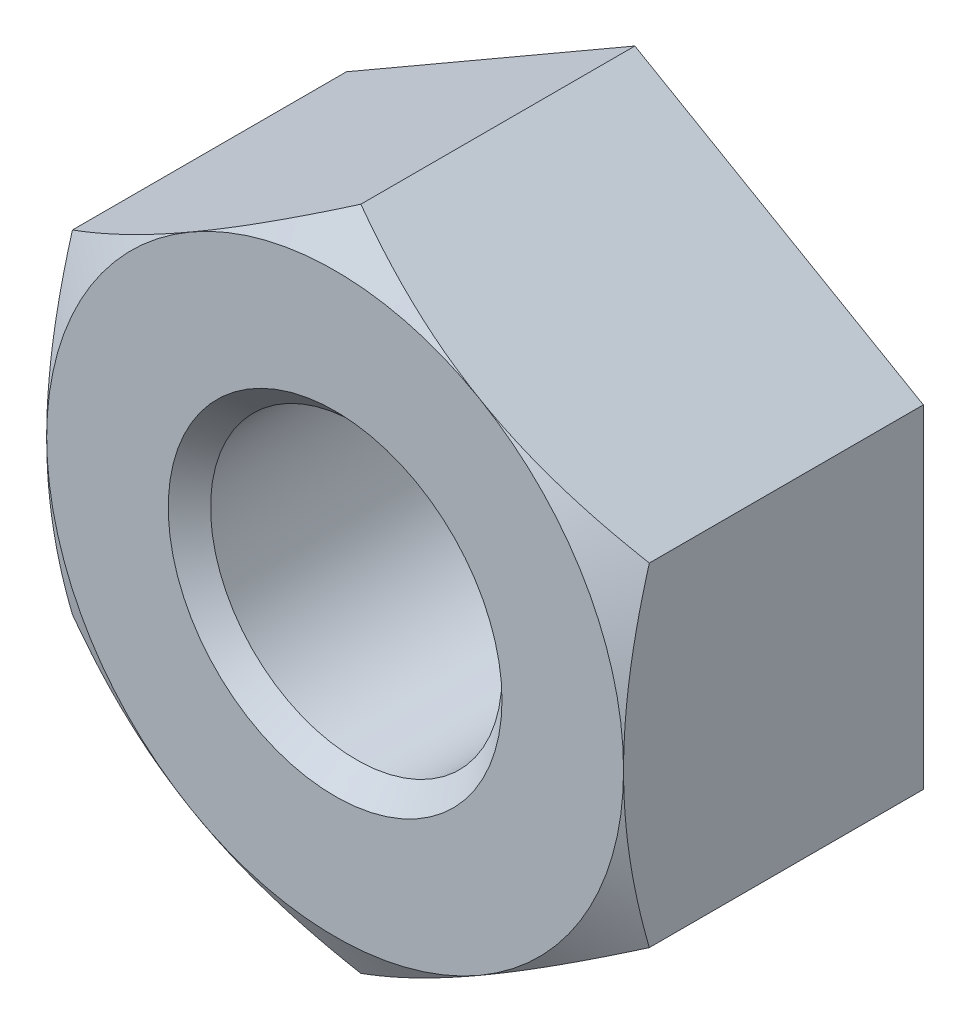
ISO-10303-21;
HEADER;
FILE_DESCRIPTION(('STEP AP214'),'2;1');
FILE_NAME('part.step','',(''),(''),'','','');
FILE_SCHEMA(('AUTOMOTIVE_DESIGN { 1 0 10303 214 1 1 1 1 }'));
ENDSEC;
DATA;
#1=APPLICATION_CONTEXT('core data for automotive mechanical design processes');
#2=APPLICATION_PROTOCOL_DEFINITION('international standard','automotive_design',2000,#1);
#3=PRODUCT_CONTEXT('',#1,'mechanical');
#4=PRODUCT('Part','Part','',(#3));
#5=PRODUCT_RELATED_PRODUCT_CATEGORY('part','',(#4));
#6=PRODUCT_DEFINITION_FORMATION('','',#4);
#7=PRODUCT_DEFINITION_CONTEXT('part definition',#1,'design');
#8=PRODUCT_DEFINITION('design','',#6,#7);
#9=PRODUCT_DEFINITION_SHAPE('','',#8);
#10=(LENGTH_UNIT() NAMED_UNIT(*) SI_UNIT(.MILLI.,.METRE.));
#11=(NAMED_UNIT(*) PLANE_ANGLE_UNIT() SI_UNIT($,.RADIAN.));
#12=(NAMED_UNIT(*) SI_UNIT($,.STERADIAN.) SOLID_ANGLE_UNIT());
#13=UNCERTAINTY_MEASURE_WITH_UNIT(LENGTH_MEASURE(1.E-05),#10,'distance_accuracy_value','');
#14=(GEOMETRIC_REPRESENTATION_CONTEXT(3) GLOBAL_UNCERTAINTY_ASSIGNED_CONTEXT((#13)) GLOBAL_UNIT_ASSIGNED_CONTEXT((#10,
#11,#12)) REPRESENTATION_CONTEXT('',''));
#15=CARTESIAN_POINT('',(0.,0.,0.));
#16=DIRECTION('',(0.,0.,1.));
#17=DIRECTION('',(1.,0.,0.));
#18=AXIS2_PLACEMENT_3D('',#15,#16,#17);
#19=CARTESIAN_POINT('',(0.,-24.,21.6));
#20=DIRECTION('',(-0.5,0.866025403784439,0.));
#21=DIRECTION('',(-0.866025403784439,-0.5,0.));
#22=AXIS2_PLACEMENT_3D('',#19,#20,#21);
#23=PLANE('',#22);
#24=CARTESIAN_POINT('',(-0.000199999999996838,-24.0001154700538,19.7435268723012));
#25=CARTESIAN_POINT('',(0.456636902036748,-23.7363605616872,19.8957950231701));
#26=CARTESIAN_POINT('',(0.915255712969352,-23.4715768677398,20.0411534574922));
#27=CARTESIAN_POINT('',(1.83617090998652,-22.9398862308411,20.3161302416855));
#28=CARTESIAN_POINT('',(2.29846845265265,-22.6729786201371,20.4457434146858));
#29=CARTESIAN_POINT('',(3.22763457782562,-22.1365243076466,20.6874874041532));
#30=CARTESIAN_POINT('',(3.69451129135353,-21.8669729114129,20.7995768558665));
#31=CARTESIAN_POINT('',(4.63150881836863,-21.3259971369607,21.0038664716216));
#32=CARTESIAN_POINT('',(5.10162944447372,-21.0545728669274,21.0960677747242));
#33=CARTESIAN_POINT('',(6.03306874892725,-20.5168061337673,21.2566595090508));
#34=CARTESIAN_POINT('',(6.4943182779903,-20.2505035939992,21.3255814723418));
#35=CARTESIAN_POINT('',(7.41893082723539,-19.7166782897964,21.4411479838631));
#36=CARTESIAN_POINT('',(7.88229388792627,-19.449155501974,21.4877921032801));
#37=CARTESIAN_POINT('',(8.8097983795347,-18.9136605340693,21.5576251858173));
#38=CARTESIAN_POINT('',(9.2739382259314,-18.6456892688105,21.5808420204719));
#39=CARTESIAN_POINT('',(10.2026462473922,-18.1094994426216,21.6033212604247));
#40=CARTESIAN_POINT('',(10.667214408777,-17.8412808895891,21.6025844059287));
#41=CARTESIAN_POINT('',(11.5357335216089,-17.3398411459993,21.578829236137));
#42=CARTESIAN_POINT('',(11.9397463270788,-17.1065842440052,21.5587076543318));
#43=CARTESIAN_POINT('',(12.7468074120657,-16.6406273093356,21.5007301929938));
#44=CARTESIAN_POINT('',(13.1498557053137,-16.4079272687324,21.4628745674587));
#45=CARTESIAN_POINT('',(13.9548388513136,-15.9431700326963,21.3700851020353));
#46=CARTESIAN_POINT('',(14.3567723642648,-15.7111136107975,21.3151358186335));
#47=CARTESIAN_POINT('',(15.158714854449,-15.2481118982151,21.1891315548785));
#48=CARTESIAN_POINT('',(15.5587238398289,-15.0171666028277,21.1180766427664));
#49=CARTESIAN_POINT('',(16.7730660131039,-14.3160658221991,20.8789299412628));
#50=CARTESIAN_POINT('',(17.5839490231285,-13.8479022980801,20.6869794527175));
#51=CARTESIAN_POINT('',(18.7913185058485,-13.1508272022204,20.3601926803062));
#52=CARTESIAN_POINT('',(19.1919365207695,-12.9195302834635,20.2449045107318));
#53=CARTESIAN_POINT('',(19.9904015202256,-12.458536301089,20.0026566529107));
#54=CARTESIAN_POINT('',(20.3882492519732,-12.2288388060681,19.8757002543211));
#55=CARTESIAN_POINT('',(20.7848096908265,-11.9998845299462,19.7435268723012));
#56=B_SPLINE_CURVE_WITH_KNOTS('',3,(#24,#25,#26,#27,#28,#29,#30,#31,#32,#33,#34,#35,#36,#37,#38,
#39,#40,#41,#42,#43,#44,#45,#46,#47,#48,#49,#50,#51,#52,#53,#54,#55),.UNSPECIFIED.,.F.,.F.,(4,2,
2,2,2,2,2,2,2,2,2,2,2,2,2,4),(0.,1.64718297300076,3.29490606443561,4.94646171874214,
6.597922757806,8.2086223270406,9.81935289844249,11.4281649098404,13.0369272065082,
14.4374315945823,15.8379159244004,17.2396692350121,18.6414166063712,21.5066563429885,
22.9367804503371,24.3665025883493),.UNSPECIFIED.);
#57=CARTESIAN_POINT('',(0.,-24.,19.743593539449));
#58=VERTEX_POINT('',#57);
#59=CARTESIAN_POINT('',(10.3923048454132,-18.,21.6));
#60=VERTEX_POINT('',#59);
#61=EDGE_CURVE('E231',#58,#60,#56,.T.);
#62=ORIENTED_EDGE('',*,*,#61,.F.);
#63=DIRECTION('',(0.,0.,-1.));
#64=VECTOR('',#63,1.);
#65=CARTESIAN_POINT('',(0.,-24.,21.6));
#66=LINE('',#65,#64);
#67=CARTESIAN_POINT('',(0.,-24.,0.));
#68=VERTEX_POINT('',#67);
#69=EDGE_CURVE('E234',#58,#68,#66,.T.);
#70=ORIENTED_EDGE('',*,*,#69,.T.);
#71=DIRECTION('',(0.866025403784439,0.5,0.));
#72=VECTOR('',#71,1.);
#73=CARTESIAN_POINT('',(0.,-24.,0.));
#74=LINE('',#73,#72);
#75=CARTESIAN_POINT('',(20.7846096908265,-12.,0.));
#76=VERTEX_POINT('',#75);
#77=EDGE_CURVE('E238',#68,#76,#74,.T.);
#78=ORIENTED_EDGE('',*,*,#77,.T.);
#79=DIRECTION('',(0.,0.,-1.));
#80=VECTOR('',#79,1.);
#81=CARTESIAN_POINT('',(20.7846096908265,-12.,21.6));
#82=LINE('',#81,#80);
#83=CARTESIAN_POINT('',(20.7846096908265,-12.,19.743593539449));
#84=VERTEX_POINT('',#83);
#85=EDGE_CURVE('E262',#84,#76,#82,.T.);
#86=ORIENTED_EDGE('',*,*,#85,.F.);
#87=EDGE_CURVE('E185',#60,#84,#56,.T.);
#88=ORIENTED_EDGE('',*,*,#87,.F.);
#89=EDGE_LOOP('',(#62,#70,#78,#86,#88));
#90=FACE_BOUND('',#89,.T.);
#91=ADVANCED_FACE('F48',(#90),#23,.F.);
#92=CARTESIAN_POINT('',(20.7846096908265,-12.,21.6));
#93=DIRECTION('',(-1.,0.,0.));
#94=DIRECTION('',(0.,0.,1.));
#95=AXIS2_PLACEMENT_3D('',#92,#93,#94);
#96=PLANE('',#95);
#97=CARTESIAN_POINT('',(20.7846096908265,-43.0997855814386,5.97397653681123));
#98=CARTESIAN_POINT('',(20.7846096908265,-42.5989361833653,6.2344351098979));
#99=CARTESIAN_POINT('',(20.7846096908265,-42.09773834524,6.4942234300361));
#100=CARTESIAN_POINT('',(20.7846096908265,-41.0945773206622,7.01232139507122));
#101=CARTESIAN_POINT('',(20.7846096908265,-40.5926141321068,7.27063103589572));
#102=CARTESIAN_POINT('',(20.7846096908265,-39.0854359948363,8.04315405656702));
#103=CARTESIAN_POINT('',(20.7846096908265,-38.0789743174458,8.55493974582766));
#104=CARTESIAN_POINT('',(20.7846096908265,-36.0605206322507,9.57142608881276));
#105=CARTESIAN_POINT('',(20.7846096908265,-35.0485224729889,10.0761145402675));
#106=CARTESIAN_POINT('',(20.7846096908265,-33.0197429936407,11.0757629369177));
#107=CARTESIAN_POINT('',(20.7846096908265,-32.0029617460945,11.5707230290674));
#108=CARTESIAN_POINT('',(20.7846096908265,-29.9067541575499,12.5757757891206));
#109=CARTESIAN_POINT('',(20.7846096908265,-28.8269944805033,13.0851745934609));
#110=CARTESIAN_POINT('',(20.7846096908265,-26.6594184021724,14.0867435367665));
#111=CARTESIAN_POINT('',(20.7846096908265,-25.5716016735173,14.5789129709707));
#112=CARTESIAN_POINT('',(20.7846096908265,-23.9327379399297,15.3001672173619));
#113=CARTESIAN_POINT('',(20.7846096908265,-23.3854029205562,15.5376926696126));
#114=CARTESIAN_POINT('',(20.7846096908265,-22.2879749234547,16.0062772481039));
#115=CARTESIAN_POINT('',(20.7846096908265,-21.7378819810851,16.2373364569975));
#116=CARTESIAN_POINT('',(20.7846096908265,-20.6346672316356,16.692010759113));
#117=CARTESIAN_POINT('',(20.7846096908265,-20.0815456356525,16.9156263636518));
#118=CARTESIAN_POINT('',(20.7846096908265,-18.9719187674171,17.3542806013467));
#119=CARTESIAN_POINT('',(20.7846096908265,-18.4154135625281,17.5693194046154));
#120=CARTESIAN_POINT('',(20.7846096908265,-17.2292067630723,18.0156200363005));
#121=CARTESIAN_POINT('',(20.7846096908265,-16.5990107252842,18.2455727378192));
#122=CARTESIAN_POINT('',(20.7846096908265,-15.3334038860175,18.6907025359907));
#123=CARTESIAN_POINT('',(20.7846096908265,-14.6979930955388,18.9058796638021));
#124=CARTESIAN_POINT('',(20.7846096908265,-13.4213831714848,19.3188474203842));
#125=CARTESIAN_POINT('',(20.7846096908265,-12.7801829382259,19.5166346659975));
#126=CARTESIAN_POINT('',(20.7846096908265,-11.4917797076664,19.8917108871347));
#127=CARTESIAN_POINT('',(20.7846096908265,-10.8445767180518,20.0689998889011));
#128=CARTESIAN_POINT('',(20.7846096908265,-9.55721007109625,20.3962988138016));
#129=CARTESIAN_POINT('',(20.7846096908265,-8.91716914819608,20.5467883204717));
#130=CARTESIAN_POINT('',(20.7846096908265,-7.63145591258406,20.8213386581674));
#131=CARTESIAN_POINT('',(20.7846096908265,-6.98578410003926,20.9454018121343));
#132=CARTESIAN_POINT('',(20.7846096908265,-5.68966360052536,21.1636504566021));
#133=CARTESIAN_POINT('',(20.7846096908265,-5.03921721415739,21.2578494794243));
#134=CARTESIAN_POINT('',(20.7846096908265,-3.7343790496286,21.4134191265944));
#135=CARTESIAN_POINT('',(20.7846096908265,-3.07998733027104,21.474790239009));
#136=CARTESIAN_POINT('',(20.7846096908265,-1.75816611114023,21.5632036210579));
#137=CARTESIAN_POINT('',(20.7846096908265,-1.09069765324586,21.5896713760324));
#138=CARTESIAN_POINT('',(20.7846096908265,0.244679452132822,21.6053586746947));
#139=CARTESIAN_POINT('',(20.7846096908265,0.912588098428259,21.594578318575));
#140=CARTESIAN_POINT('',(20.7846096908265,2.24690492064425,21.5361993153806));
#141=CARTESIAN_POINT('',(20.7846096908265,2.91331277985164,21.4885935158275));
#142=CARTESIAN_POINT('',(20.7846096908265,4.2426782314415,21.3583901936291));
#143=CARTESIAN_POINT('',(20.7846096908265,4.90563573087467,21.2757917332048));
#144=CARTESIAN_POINT('',(20.7846096908265,6.24071550885202,21.0763984685344));
#145=CARTESIAN_POINT('',(20.7846096908265,6.91273404643444,20.9589157039043));
#146=CARTESIAN_POINT('',(20.7846096908265,8.25083437505879,20.6941744551351));
#147=CARTESIAN_POINT('',(20.7846096908265,8.91691606787133,20.5469154792784));
#148=CARTESIAN_POINT('',(20.7846096908265,10.2429897317002,20.2264439842866));
#149=CARTESIAN_POINT('',(20.7846096908265,10.9029796227504,20.0532229251456));
#150=CARTESIAN_POINT('',(20.7846096908265,12.21668653217,19.6845668997067));
#151=CARTESIAN_POINT('',(20.7846096908265,12.8704035339689,19.489131874746));
#152=CARTESIAN_POINT('',(20.7846096908265,14.187002415088,19.0746262073177));
#153=CARTESIAN_POINT('',(20.7846096908265,14.8497437954169,18.8551115394823));
#154=CARTESIAN_POINT('',(20.7846096908265,16.1694965483315,18.3994198467114));
#155=CARTESIAN_POINT('',(20.7846096908265,16.8265075325798,18.1632417022331));
#156=CARTESIAN_POINT('',(20.7846096908265,18.1354729138445,17.6768046587224));
#157=CARTESIAN_POINT('',(20.7846096908265,18.7874259456337,17.4265420988875));
#158=CARTESIAN_POINT('',(20.7846096908265,20.0866415749163,16.9141967733352));
#159=CARTESIAN_POINT('',(20.7846096908265,20.7339042699333,16.6521142542072));
#160=CARTESIAN_POINT('',(20.7846096908265,22.0251484330647,16.1175861645394));
#161=CARTESIAN_POINT('',(20.7846096908265,22.6691243053237,15.8451271073362));
#162=CARTESIAN_POINT('',(20.7846096908265,23.9534004319582,15.2916884664446));
#163=CARTESIAN_POINT('',(20.7846096908265,24.5937006709419,15.0107088471071));
#164=CARTESIAN_POINT('',(20.7846096908265,25.8709641196289,14.4415212743335));
#165=CARTESIAN_POINT('',(20.7846096908265,26.5079278003821,14.153314376405));
#166=CARTESIAN_POINT('',(20.7846096908265,27.7789891265454,13.5706618900675));
#167=CARTESIAN_POINT('',(20.7846096908265,28.4130867781743,13.2762163152036));
#168=CARTESIAN_POINT('',(20.7846096908265,30.2328321620722,12.4218213030788));
#169=CARTESIAN_POINT('',(20.7846096908265,31.4153118160678,11.855122180744));
#170=CARTESIAN_POINT('',(20.7846096908265,33.773262860061,10.7072618870471));
#171=CARTESIAN_POINT('',(20.7846096908265,34.9487339603228,10.1261001228637));
#172=CARTESIAN_POINT('',(20.7846096908265,37.2894327133953,8.95476744233524));
#173=CARTESIAN_POINT('',(20.7846096908265,38.454682443985,8.36464059320867));
#174=CARTESIAN_POINT('',(20.7846096908265,40.199076625207,7.47279127501705));
#175=CARTESIAN_POINT('',(20.7846096908265,40.7799348778304,7.17441208481234));
#176=CARTESIAN_POINT('',(20.7846096908265,41.940612358727,6.57564580385574));
#177=CARTESIAN_POINT('',(20.7846096908265,42.5204315917301,6.2752587222739));
#178=CARTESIAN_POINT('',(20.7846096908265,43.0997855814386,5.97397653681123));
#179=B_SPLINE_CURVE_WITH_KNOTS('',3,(#97,#98,#99,#100,#101,#102,#103,#104,#105,#106,#107,#108,
#109,#110,#111,#112,#113,#114,#115,#116,#117,#118,#119,#120,#121,#122,#123,#124,#125,#126,#127,
#128,#129,#130,#131,#132,#133,#134,#135,#136,#137,#138,#139,#140,#141,#142,#143,#144,#145,#146,
#147,#148,#149,#150,#151,#152,#153,#154,#155,#156,#157,#158,#159,#160,#161,#162,#163,#164,#165,
#166,#167,#168,#169,#170,#171,#172,#173,#174,#175,#176,#177,#178),.UNSPECIFIED.,.F.,.F.,(4,2,2,
2,2,2,2,2,2,2,2,2,2,2,2,2,2,2,2,2,2,2,2,2,2,2,2,2,2,2,2,2,2,2,2,2,2,2,2,2,4),(0.,
1.69357486877677,3.38715439956217,6.7744549869629,10.1670023352168,13.5594983970648,
17.1410530675821,20.7227540695419,22.5126777468645,24.3025785345073,26.0923561152539,
27.8820981797877,29.8944586297115,31.906814835852,33.9195616785055,35.9323059443584,
37.9043039785198,39.876128597607,41.847058443329,43.8179589855703,45.8209119003034,
47.823859427361,49.82719607769,51.8305864194563,53.8764565307001,55.9223604297369,
57.9689387944581,60.0155225639183,62.1097094000332,64.2040370692012,66.2989116301004,
68.3937425076649,70.4913958074674,72.5890578848244,74.6864153731571,76.7837683083221,
80.7174069081152,84.6512070135627,88.5696385660031,90.5286757028045,92.4877038987843),.UNSPECIFIED.);
#180=CARTESIAN_POINT('',(20.7846096908265,0.,21.6));
#181=VERTEX_POINT('',#180);
#182=EDGE_CURVE('E314',#84,#181,#179,.T.);
#183=ORIENTED_EDGE('',*,*,#182,.F.);
#184=ORIENTED_EDGE('',*,*,#85,.T.);
#185=DIRECTION('',(0.,1.,0.));
#186=VECTOR('',#185,1.);
#187=CARTESIAN_POINT('',(20.7846096908265,-12.,0.));
#188=LINE('',#187,#186);
#189=CARTESIAN_POINT('',(20.7846096908265,12.,0.));
#190=VERTEX_POINT('',#189);
#191=EDGE_CURVE('E319',#76,#190,#188,.T.);
#192=ORIENTED_EDGE('',*,*,#191,.T.);
#193=DIRECTION('',(0.,0.,-1.));
#194=VECTOR('',#193,1.);
#195=CARTESIAN_POINT('',(20.7846096908265,12.,21.6));
#196=LINE('',#195,#194);
#197=CARTESIAN_POINT('',(20.7846096908265,12.,19.743593539449));
#198=VERTEX_POINT('',#197);
#199=EDGE_CURVE('E260',#198,#190,#196,.T.);
#200=ORIENTED_EDGE('',*,*,#199,.F.);
#201=EDGE_CURVE('E125',#181,#198,#179,.T.);
#202=ORIENTED_EDGE('',*,*,#201,.F.);
#203=EDGE_LOOP('',(#183,#184,#192,#200,#202));
#204=FACE_BOUND('',#203,.T.);
#205=ADVANCED_FACE('F222',(#204),#96,.F.);
#206=CARTESIAN_POINT('',(20.7846096908265,12.,21.6));
#207=DIRECTION('',(-0.5,-0.866025403784439,0.));
#208=DIRECTION('',(0.866025403784439,-0.5,0.));
#209=AXIS2_PLACEMENT_3D('',#206,#207,#208);
#210=PLANE('',#209);
#211=CARTESIAN_POINT('',(20.7848096908265,11.9998845299462,19.7435268723012));
#212=CARTESIAN_POINT('',(20.3279727887898,12.2636394383128,19.8957950231701));
#213=CARTESIAN_POINT('',(19.8693539778572,12.5284231322602,20.0411534574922));
#214=CARTESIAN_POINT('',(18.94843878084,13.0601137691589,20.3161302416855));
#215=CARTESIAN_POINT('',(18.4861412381739,13.3270213798629,20.4457434146858));
#216=CARTESIAN_POINT('',(17.5569751130009,13.8634756923534,20.6874874041532));
#217=CARTESIAN_POINT('',(17.090098399473,14.1330270885871,20.7995768558665));
#218=CARTESIAN_POINT('',(16.1531008724579,14.6740028630393,21.0038664716216));
#219=CARTESIAN_POINT('',(15.6829802463528,14.9454271330726,21.0960677747242));
#220=CARTESIAN_POINT('',(14.7515409418993,15.4831938662327,21.2566595090508));
#221=CARTESIAN_POINT('',(14.2902914128362,15.7494964060008,21.3255814723418));
#222=CARTESIAN_POINT('',(13.3656788635911,16.2833217102036,21.4411479838631));
#223=CARTESIAN_POINT('',(12.9023158029002,16.550844498026,21.4877921032801));
#224=CARTESIAN_POINT('',(11.9748113112918,17.0863394659307,21.5576251858173));
#225=CARTESIAN_POINT('',(11.5106714648951,17.3543107311895,21.5808420204719));
#226=CARTESIAN_POINT('',(10.5819634434344,17.8905005573784,21.6033212604247));
#227=CARTESIAN_POINT('',(10.1173952820495,18.1587191104109,21.6025844059287));
#228=CARTESIAN_POINT('',(9.24887616921765,18.6601588540007,21.578829236137));
#229=CARTESIAN_POINT('',(8.84486336374767,18.8934157559948,21.5587076543318));
#230=CARTESIAN_POINT('',(8.03780227876085,19.3593726906644,21.5007301929938));
#231=CARTESIAN_POINT('',(7.63475398551279,19.5920727312676,21.4628745674587));
#232=CARTESIAN_POINT('',(6.82977083951291,20.0568299673038,21.3700851020353));
#233=CARTESIAN_POINT('',(6.42783732656167,20.2888863892025,21.3151358186335));
#234=CARTESIAN_POINT('',(5.62589483637755,20.7518881017849,21.1891315548785));
#235=CARTESIAN_POINT('',(5.22588585099759,20.9828333971723,21.1180766427664));
#236=CARTESIAN_POINT('',(4.01154367772264,21.6839341778009,20.8789299412628));
#237=CARTESIAN_POINT('',(3.200660667698,22.1520977019199,20.6869794527175));
#238=CARTESIAN_POINT('',(1.99329118497798,22.8491727977797,20.3601926803062));
#239=CARTESIAN_POINT('',(1.59267317005705,23.0804697165365,20.2449045107318));
#240=CARTESIAN_POINT('',(0.794208170600872,23.541463698911,20.0026566529107));
#241=CARTESIAN_POINT('',(0.396360438853325,23.7711611939319,19.8757002543211));
#242=CARTESIAN_POINT('',(-0.00019999999998815,24.0001154700538,19.7435268723012));
#243=B_SPLINE_CURVE_WITH_KNOTS('',3,(#211,#212,#213,#214,#215,#216,#217,#218,#219,#220,#221,
#222,#223,#224,#225,#226,#227,#228,#229,#230,#231,#232,#233,#234,#235,#236,#237,#238,#239,#240,
#241,#242),.UNSPECIFIED.,.F.,.F.,(4,2,2,2,2,2,2,2,2,2,2,2,2,2,2,4),(0.,1.64718297300076,
3.29490606443561,4.94646171874215,6.59792275780601,8.20862232704061,9.81935289844249,
11.4281649098404,13.0369272065082,14.4374315945823,15.8379159244004,17.2396692350121,
18.6414166063712,21.5066563429885,22.9367804503371,24.3665025883493),.UNSPECIFIED.);
#244=CARTESIAN_POINT('',(10.3923048454133,18.,21.6));
#245=VERTEX_POINT('',#244);
#246=EDGE_CURVE('E121',#198,#245,#243,.T.);
#247=ORIENTED_EDGE('',*,*,#246,.F.);
#248=ORIENTED_EDGE('',*,*,#199,.T.);
#249=DIRECTION('',(-0.866025403784439,0.5,0.));
#250=VECTOR('',#249,1.);
#251=CARTESIAN_POINT('',(20.7846096908265,12.,0.));
#252=LINE('',#251,#250);
#253=CARTESIAN_POINT('',(0.,24.,0.));
#254=VERTEX_POINT('',#253);
#255=EDGE_CURVE('E321',#190,#254,#252,.T.);
#256=ORIENTED_EDGE('',*,*,#255,.T.);
#257=DIRECTION('',(0.,0.,-1.));
#258=VECTOR('',#257,1.);
#259=CARTESIAN_POINT('',(0.,24.,21.6));
#260=LINE('',#259,#258);
#261=CARTESIAN_POINT('',(0.,24.,19.743593539449));
#262=VERTEX_POINT('',#261);
#263=EDGE_CURVE('E148',#262,#254,#260,.T.);
#264=ORIENTED_EDGE('',*,*,#263,.F.);
#265=EDGE_CURVE('E130',#245,#262,#243,.T.);
#266=ORIENTED_EDGE('',*,*,#265,.F.);
#267=EDGE_LOOP('',(#247,#248,#256,#264,#266));
#268=FACE_BOUND('',#267,.T.);
#269=ADVANCED_FACE('F146',(#268),#210,.F.);
#270=CARTESIAN_POINT('',(0.,24.,21.6));
#271=DIRECTION('',(0.5,-0.866025403784439,0.));
#272=DIRECTION('',(0.866025403784439,0.5,0.));
#273=AXIS2_PLACEMENT_3D('',#270,#271,#272);
#274=PLANE('',#273);
#275=CARTESIAN_POINT('',(0.000200000000014088,24.0001154700538,19.7435268723012));
#276=CARTESIAN_POINT('',(-0.45663690203673,23.7363605616872,19.8957950231701));
#277=CARTESIAN_POINT('',(-0.915255712969335,23.4715768677398,20.0411534574921));
#278=CARTESIAN_POINT('',(-1.83617090998651,22.9398862308411,20.3161302416855));
#279=CARTESIAN_POINT('',(-2.29846845265264,22.6729786201371,20.4457434146858));
#280=CARTESIAN_POINT('',(-3.2276345778256,22.1365243076466,20.6874874041532));
#281=CARTESIAN_POINT('',(-3.69451129135352,21.8669729114129,20.7995768558665));
#282=CARTESIAN_POINT('',(-4.63150881836862,21.3259971369607,21.0038664716216));
#283=CARTESIAN_POINT('',(-5.10162944447371,21.0545728669274,21.0960677747242));
#284=CARTESIAN_POINT('',(-6.03306874892724,20.5168061337673,21.2566595090508));
#285=CARTESIAN_POINT('',(-6.49431827799028,20.2505035939992,21.3255814723418));
#286=CARTESIAN_POINT('',(-7.41893082723537,19.7166782897964,21.4411479838631));
#287=CARTESIAN_POINT('',(-7.88229388792626,19.449155501974,21.4877921032801));
#288=CARTESIAN_POINT('',(-8.80979837953469,18.9136605340693,21.5576251858173));
#289=CARTESIAN_POINT('',(-9.27393822593138,18.6456892688105,21.5808420204719));
#290=CARTESIAN_POINT('',(-10.2026462473921,18.1094994426216,21.6033212604247));
#291=CARTESIAN_POINT('',(-10.667214408777,17.8412808895892,21.6025844059287));
#292=CARTESIAN_POINT('',(-11.5357335216088,17.3398411459993,21.578829236137));
#293=CARTESIAN_POINT('',(-11.9397463270788,17.1065842440052,21.5587076543318));
#294=CARTESIAN_POINT('',(-12.7468074120657,16.6406273093356,21.5007301929938));
#295=CARTESIAN_POINT('',(-13.1498557053137,16.4079272687324,21.4628745674587));
#296=CARTESIAN_POINT('',(-13.9548388513136,15.9431700326962,21.3700851020354));
#297=CARTESIAN_POINT('',(-14.3567723642648,15.7111136107975,21.3151358186335));
#298=CARTESIAN_POINT('',(-15.158714854449,15.2481118982151,21.1891315548785));
#299=CARTESIAN_POINT('',(-15.5587238398289,15.0171666028277,21.1180766427664));
#300=CARTESIAN_POINT('',(-16.7730660131039,14.3160658221991,20.8789299412628));
#301=CARTESIAN_POINT('',(-17.5839490231285,13.8479022980801,20.6869794527175));
#302=CARTESIAN_POINT('',(-18.7913185058485,13.1508272022203,20.3601926803062));
#303=CARTESIAN_POINT('',(-19.1919365207695,12.9195302834635,20.2449045107318));
#304=CARTESIAN_POINT('',(-19.9904015202257,12.458536301089,20.0026566529107));
#305=CARTESIAN_POINT('',(-20.3882492519732,12.2288388060681,19.8757002543211));
#306=CARTESIAN_POINT('',(-20.7848096908265,11.9998845299462,19.7435268723012));
#307=B_SPLINE_CURVE_WITH_KNOTS('',3,(#275,#276,#277,#278,#279,#280,#281,#282,#283,#284,#285,
#286,#287,#288,#289,#290,#291,#292,#293,#294,#295,#296,#297,#298,#299,#300,#301,#302,#303,#304,
#305,#306),.UNSPECIFIED.,.F.,.F.,(4,2,2,2,2,2,2,2,2,2,2,2,2,2,2,4),(0.,1.64718297300076,
3.29490606443561,4.94646171874214,6.59792275780601,8.2086223270406,9.81935289844249,
11.4281649098404,13.0369272065082,14.4374315945823,15.8379159244004,17.2396692350121,
18.6414166063712,21.5066563429886,22.9367804503372,24.3665025883493),.UNSPECIFIED.);
#308=CARTESIAN_POINT('',(-10.3923048454132,18.,21.6));
#309=VERTEX_POINT('',#308);
#310=EDGE_CURVE('E135',#262,#309,#307,.T.);
#311=ORIENTED_EDGE('',*,*,#310,.F.);
#312=ORIENTED_EDGE('',*,*,#263,.T.);
#313=DIRECTION('',(-0.866025403784439,-0.5,0.));
#314=VECTOR('',#313,1.);
#315=CARTESIAN_POINT('',(0.,24.,0.));
#316=LINE('',#315,#314);
#317=CARTESIAN_POINT('',(-20.7846096908265,12.,0.));
#318=VERTEX_POINT('',#317);
#319=EDGE_CURVE('E326',#254,#318,#316,.T.);
#320=ORIENTED_EDGE('',*,*,#319,.T.);
#321=DIRECTION('',(0.,0.,-1.));
#322=VECTOR('',#321,1.);
#323=CARTESIAN_POINT('',(-20.7846096908265,12.,21.6));
#324=LINE('',#323,#322);
#325=CARTESIAN_POINT('',(-20.7846096908265,12.,19.743593539449));
#326=VERTEX_POINT('',#325);
#327=EDGE_CURVE('E250',#326,#318,#324,.T.);
#328=ORIENTED_EDGE('',*,*,#327,.F.);
#329=EDGE_CURVE('E151',#309,#326,#307,.T.);
#330=ORIENTED_EDGE('',*,*,#329,.F.);
#331=EDGE_LOOP('',(#311,#312,#320,#328,#330));
#332=FACE_BOUND('',#331,.T.);
#333=ADVANCED_FACE('F213',(#332),#274,.F.);
#334=CARTESIAN_POINT('',(-20.7846096908265,12.,21.6));
#335=DIRECTION('',(1.,0.,0.));
#336=DIRECTION('',(0.,0.,-1.));
#337=AXIS2_PLACEMENT_3D('',#334,#335,#336);
#338=PLANE('',#337);
#339=CARTESIAN_POINT('',(-20.7846096908265,43.0997855814385,5.97397653681125));
#340=CARTESIAN_POINT('',(-20.7846096908265,42.5989361833652,6.23443510989792));
#341=CARTESIAN_POINT('',(-20.7846096908265,42.0977383452399,6.49422343003613));
#342=CARTESIAN_POINT('',(-20.7846096908265,41.0945773206622,7.01232139507124));
#343=CARTESIAN_POINT('',(-20.7846096908265,40.5926141321067,7.27063103589574));
#344=CARTESIAN_POINT('',(-20.7846096908265,39.0854359948363,8.04315405656704));
#345=CARTESIAN_POINT('',(-20.7846096908265,38.0789743174458,8.55493974582768));
#346=CARTESIAN_POINT('',(-20.7846096908265,36.0605206322506,9.57142608881278));
#347=CARTESIAN_POINT('',(-20.7846096908265,35.0485224729888,10.0761145402675));
#348=CARTESIAN_POINT('',(-20.7846096908265,33.0197429936407,11.0757629369177));
#349=CARTESIAN_POINT('',(-20.7846096908265,32.0029617460944,11.5707230290674));
#350=CARTESIAN_POINT('',(-20.7846096908265,29.9067541575498,12.5757757891206));
#351=CARTESIAN_POINT('',(-20.7846096908265,28.8269944805032,13.0851745934609));
#352=CARTESIAN_POINT('',(-20.7846096908265,26.6594184021724,14.0867435367665));
#353=CARTESIAN_POINT('',(-20.7846096908265,25.5716016735172,14.5789129709707));
#354=CARTESIAN_POINT('',(-20.7846096908265,23.9327379399297,15.3001672173619));
#355=CARTESIAN_POINT('',(-20.7846096908265,23.3854029205562,15.5376926696126));
#356=CARTESIAN_POINT('',(-20.7846096908265,22.2879749234547,16.0062772481039));
#357=CARTESIAN_POINT('',(-20.7846096908265,21.7378819810851,16.2373364569975));
#358=CARTESIAN_POINT('',(-20.7846096908265,20.6346672316356,16.692010759113));
#359=CARTESIAN_POINT('',(-20.7846096908265,20.0815456356524,16.9156263636518));
#360=CARTESIAN_POINT('',(-20.7846096908265,18.9719187674171,17.3542806013467));
#361=CARTESIAN_POINT('',(-20.7846096908265,18.4154135625281,17.5693194046154));
#362=CARTESIAN_POINT('',(-20.7846096908265,17.2292067630722,18.0156200363005));
#363=CARTESIAN_POINT('',(-20.7846096908265,16.5990107252841,18.2455727378192));
#364=CARTESIAN_POINT('',(-20.7846096908265,15.3334038860174,18.6907025359907));
#365=CARTESIAN_POINT('',(-20.7846096908265,14.6979930955388,18.9058796638021));
#366=CARTESIAN_POINT('',(-20.7846096908265,13.4213831714848,19.3188474203843));
#367=CARTESIAN_POINT('',(-20.7846096908265,12.7801829382259,19.5166346659975));
#368=CARTESIAN_POINT('',(-20.7846096908265,11.4917797076664,19.8917108871347));
#369=CARTESIAN_POINT('',(-20.7846096908265,10.8445767180518,20.0689998889011));
#370=CARTESIAN_POINT('',(-20.7846096908265,9.5572100710962,20.3962988138016));
#371=CARTESIAN_POINT('',(-20.7846096908265,8.91716914819603,20.5467883204717));
#372=CARTESIAN_POINT('',(-20.7846096908265,7.63145591258401,20.8213386581674));
#373=CARTESIAN_POINT('',(-20.7846096908265,6.98578410003921,20.9454018121343));
#374=CARTESIAN_POINT('',(-20.7846096908265,5.68966360052531,21.1636504566021));
#375=CARTESIAN_POINT('',(-20.7846096908265,5.03921721415735,21.2578494794243));
#376=CARTESIAN_POINT('',(-20.7846096908265,3.73437904962856,21.4134191265944));
#377=CARTESIAN_POINT('',(-20.7846096908265,3.079987330271,21.474790239009));
#378=CARTESIAN_POINT('',(-20.7846096908265,1.75816611114019,21.5632036210579));
#379=CARTESIAN_POINT('',(-20.7846096908265,1.09069765324582,21.5896713760323));
#380=CARTESIAN_POINT('',(-20.7846096908265,-0.244679452132861,21.6053586746947));
#381=CARTESIAN_POINT('',(-20.7846096908265,-0.912588098428299,21.594578318575));
#382=CARTESIAN_POINT('',(-20.7846096908265,-2.24690492064429,21.5361993153806));
#383=CARTESIAN_POINT('',(-20.7846096908265,-2.91331277985168,21.4885935158274));
#384=CARTESIAN_POINT('',(-20.7846096908265,-4.24267823144154,21.3583901936291));
#385=CARTESIAN_POINT('',(-20.7846096908265,-4.90563573087471,21.2757917332048));
#386=CARTESIAN_POINT('',(-20.7846096908265,-6.24071550885206,21.0763984685344));
#387=CARTESIAN_POINT('',(-20.7846096908265,-6.91273404643448,20.9589157039043));
#388=CARTESIAN_POINT('',(-20.7846096908265,-8.25083437505883,20.6941744551351));
#389=CARTESIAN_POINT('',(-20.7846096908265,-8.91691606787137,20.5469154792784));
#390=CARTESIAN_POINT('',(-20.7846096908265,-10.2429897317002,20.2264439842866));
#391=CARTESIAN_POINT('',(-20.7846096908265,-10.9029796227505,20.0532229251456));
#392=CARTESIAN_POINT('',(-20.7846096908265,-12.21668653217,19.6845668997067));
#393=CARTESIAN_POINT('',(-20.7846096908265,-12.8704035339689,19.489131874746));
#394=CARTESIAN_POINT('',(-20.7846096908265,-14.187002415088,19.0746262073176));
#395=CARTESIAN_POINT('',(-20.7846096908265,-14.8497437954169,18.8551115394823));
#396=CARTESIAN_POINT('',(-20.7846096908265,-16.1694965483315,18.3994198467114));
#397=CARTESIAN_POINT('',(-20.7846096908265,-16.8265075325798,18.1632417022331));
#398=CARTESIAN_POINT('',(-20.7846096908265,-18.1354729138445,17.6768046587224));
#399=CARTESIAN_POINT('',(-20.7846096908265,-18.7874259456337,17.4265420988875));
#400=CARTESIAN_POINT('',(-20.7846096908265,-20.0866415749163,16.9141967733352));
#401=CARTESIAN_POINT('',(-20.7846096908265,-20.7339042699334,16.6521142542072));
#402=CARTESIAN_POINT('',(-20.7846096908265,-22.0251484330647,16.1175861645393));
#403=CARTESIAN_POINT('',(-20.7846096908265,-22.6691243053237,15.8451271073362));
#404=CARTESIAN_POINT('',(-20.7846096908265,-23.9534004319582,15.2916884664446));
#405=CARTESIAN_POINT('',(-20.7846096908265,-24.5937006709419,15.0107088471071));
#406=CARTESIAN_POINT('',(-20.7846096908265,-25.8709641196289,14.4415212743335));
#407=CARTESIAN_POINT('',(-20.7846096908265,-26.5079278003821,14.1533143764049));
#408=CARTESIAN_POINT('',(-20.7846096908265,-27.7789891265454,13.5706618900675));
#409=CARTESIAN_POINT('',(-20.7846096908265,-28.4130867781743,13.2762163152036));
#410=CARTESIAN_POINT('',(-20.7846096908265,-30.2328321620722,12.4218213030788));
#411=CARTESIAN_POINT('',(-20.7846096908265,-31.4153118160678,11.855122180744));
#412=CARTESIAN_POINT('',(-20.7846096908265,-33.7732628600609,10.7072618870471));
#413=CARTESIAN_POINT('',(-20.7846096908265,-34.9487339603228,10.1261001228637));
#414=CARTESIAN_POINT('',(-20.7846096908265,-37.2894327133953,8.95476744233526));
#415=CARTESIAN_POINT('',(-20.7846096908265,-38.4546824439849,8.36464059320869));
#416=CARTESIAN_POINT('',(-20.7846096908265,-40.1990766252069,7.47279127501708));
#417=CARTESIAN_POINT('',(-20.7846096908265,-40.7799348778303,7.17441208481237));
#418=CARTESIAN_POINT('',(-20.7846096908265,-41.9406123587269,6.57564580385577));
#419=CARTESIAN_POINT('',(-20.7846096908265,-42.52043159173,6.27525872227393));
#420=CARTESIAN_POINT('',(-20.7846096908265,-43.0997855814385,5.97397653681126));
#421=B_SPLINE_CURVE_WITH_KNOTS('',3,(#339,#340,#341,#342,#343,#344,#345,#346,#347,#348,#349,
#350,#351,#352,#353,#354,#355,#356,#357,#358,#359,#360,#361,#362,#363,#364,#365,#366,#367,#368,
#369,#370,#371,#372,#373,#374,#375,#376,#377,#378,#379,#380,#381,#382,#383,#384,#385,#386,#387,
#388,#389,#390,#391,#392,#393,#394,#395,#396,#397,#398,#399,#400,#401,#402,#403,#404,#405,#406,
#407,#408,#409,#410,#411,#412,#413,#414,#415,#416,#417,#418,#419,#420),.UNSPECIFIED.,.F.,.F.,(4,
2,2,2,2,2,2,2,2,2,2,2,2,2,2,2,2,2,2,2,2,2,2,2,2,2,2,2,2,2,2,2,2,2,2,2,2,2,2,2,4),(0.,
1.69357486877677,3.38715439956217,6.77445498696289,10.1670023352168,13.5594983970647,
17.141053067582,20.7227540695419,22.5126777468645,24.3025785345073,26.0923561152539,
27.8820981797876,29.8944586297115,31.906814835852,33.9195616785055,35.9323059443583,
37.9043039785198,39.876128597607,41.847058443329,43.8179589855703,45.8209119003034,
47.823859427361,49.82719607769,51.8305864194562,53.8764565307001,55.9223604297369,
57.9689387944581,60.0155225639183,62.1097094000332,64.2040370692011,66.2989116301003,
68.3937425076649,70.4913958074673,72.5890578848243,74.686415373157,76.7837683083221,
80.7174069081151,84.6512070135626,88.569638566003,90.5286757028044,92.4877038987842),.UNSPECIFIED.);
#422=CARTESIAN_POINT('',(-20.7846096908265,0.,21.6));
#423=VERTEX_POINT('',#422);
#424=EDGE_CURVE('E207',#326,#423,#421,.T.);
#425=ORIENTED_EDGE('',*,*,#424,.F.);
#426=ORIENTED_EDGE('',*,*,#327,.T.);
#427=DIRECTION('',(0.,-1.,0.));
#428=VECTOR('',#427,1.);
#429=CARTESIAN_POINT('',(-20.7846096908265,12.,0.));
#430=LINE('',#429,#428);
#431=CARTESIAN_POINT('',(-20.7846096908265,-12.,0.));
#432=VERTEX_POINT('',#431);
#433=EDGE_CURVE('E252',#318,#432,#430,.T.);
#434=ORIENTED_EDGE('',*,*,#433,.T.);
#435=DIRECTION('',(0.,0.,-1.));
#436=VECTOR('',#435,1.);
#437=CARTESIAN_POINT('',(-20.7846096908265,-12.,21.6));
#438=LINE('',#437,#436);
#439=CARTESIAN_POINT('',(-20.7846096908265,-12.,19.743593539449));
#440=VERTEX_POINT('',#439);
#441=EDGE_CURVE('E246',#440,#432,#438,.T.);
#442=ORIENTED_EDGE('',*,*,#441,.F.);
#443=EDGE_CURVE('E200',#423,#440,#421,.T.);
#444=ORIENTED_EDGE('',*,*,#443,.F.);
#445=EDGE_LOOP('',(#425,#426,#434,#442,#444));
#446=FACE_BOUND('',#445,.T.);
#447=ADVANCED_FACE('F209',(#446),#338,.F.);
#448=CARTESIAN_POINT('',(-20.7846096908265,-12.,21.6));
#449=DIRECTION('',(0.5,0.866025403784439,0.));
#450=DIRECTION('',(-0.866025403784439,0.5,0.));
#451=AXIS2_PLACEMENT_3D('',#448,#449,#450);
#452=PLANE('',#451);
#453=CARTESIAN_POINT('',(-20.7848096908265,-11.9998845299462,19.7435268723012));
#454=CARTESIAN_POINT('',(-20.3279727887898,-12.2636394383128,19.8957950231701));
#455=CARTESIAN_POINT('',(-19.8693539778572,-12.5284231322602,20.0411534574922));
#456=CARTESIAN_POINT('',(-18.94843878084,-13.0601137691589,20.3161302416855));
#457=CARTESIAN_POINT('',(-18.4861412381739,-13.3270213798629,20.4457434146858));
#458=CARTESIAN_POINT('',(-17.5569751130009,-13.8634756923534,20.6874874041532));
#459=CARTESIAN_POINT('',(-17.090098399473,-14.1330270885871,20.7995768558665));
#460=CARTESIAN_POINT('',(-16.1531008724579,-14.6740028630393,21.0038664716216));
#461=CARTESIAN_POINT('',(-15.6829802463528,-14.9454271330726,21.0960677747242));
#462=CARTESIAN_POINT('',(-14.7515409418993,-15.4831938662327,21.2566595090508));
#463=CARTESIAN_POINT('',(-14.2902914128362,-15.7494964060008,21.3255814723418));
#464=CARTESIAN_POINT('',(-13.3656788635911,-16.2833217102036,21.4411479838631));
#465=CARTESIAN_POINT('',(-12.9023158029003,-16.550844498026,21.4877921032801));
#466=CARTESIAN_POINT('',(-11.9748113112918,-17.0863394659307,21.5576251858173));
#467=CARTESIAN_POINT('',(-11.5106714648951,-17.3543107311894,21.580842020472));
#468=CARTESIAN_POINT('',(-10.5819634434344,-17.8905005573784,21.6033212604247));
#469=CARTESIAN_POINT('',(-10.1173952820495,-18.1587191104108,21.6025844059287));
#470=CARTESIAN_POINT('',(-9.24887616921766,-18.6601588540007,21.578829236137));
#471=CARTESIAN_POINT('',(-8.84486336374768,-18.8934157559948,21.5587076543318));
#472=CARTESIAN_POINT('',(-8.03780227876086,-19.3593726906644,21.5007301929938));
#473=CARTESIAN_POINT('',(-7.6347539855128,-19.5920727312676,21.4628745674587));
#474=CARTESIAN_POINT('',(-6.82977083951292,-20.0568299673038,21.3700851020354));
#475=CARTESIAN_POINT('',(-6.42783732656167,-20.2888863892025,21.3151358186335));
#476=CARTESIAN_POINT('',(-5.62589483637755,-20.7518881017849,21.1891315548785));
#477=CARTESIAN_POINT('',(-5.22588585099759,-20.9828333971723,21.1180766427664));
#478=CARTESIAN_POINT('',(-4.01154367772263,-21.6839341778009,20.8789299412628));
#479=CARTESIAN_POINT('',(-3.20066066769799,-22.1520977019199,20.6869794527175));
#480=CARTESIAN_POINT('',(-1.99329118497797,-22.8491727977797,20.3601926803062));
#481=CARTESIAN_POINT('',(-1.59267317005704,-23.0804697165365,20.2449045107318));
#482=CARTESIAN_POINT('',(-0.794208170600861,-23.541463698911,20.0026566529107));
#483=CARTESIAN_POINT('',(-0.396360438853313,-23.7711611939319,19.8757002543211));
#484=CARTESIAN_POINT('',(0.000200000000002829,-24.0001154700538,19.7435268723012));
#485=B_SPLINE_CURVE_WITH_KNOTS('',3,(#453,#454,#455,#456,#457,#458,#459,#460,#461,#462,#463,
#464,#465,#466,#467,#468,#469,#470,#471,#472,#473,#474,#475,#476,#477,#478,#479,#480,#481,#482,
#483,#484),.UNSPECIFIED.,.F.,.F.,(4,2,2,2,2,2,2,2,2,2,2,2,2,2,2,4),(0.,1.64718297300076,
3.29490606443561,4.94646171874214,6.597922757806,8.2086223270406,9.81935289844249,
11.4281649098404,13.0369272065082,14.4374315945823,15.8379159244004,17.2396692350121,
18.6414166063712,21.5066563429886,22.9367804503372,24.3665025883493),.UNSPECIFIED.);
#486=CARTESIAN_POINT('',(-10.3923048454133,-18.,21.6));
#487=VERTEX_POINT('',#486);
#488=EDGE_CURVE('E208',#440,#487,#485,.T.);
#489=ORIENTED_EDGE('',*,*,#488,.F.);
#490=ORIENTED_EDGE('',*,*,#441,.T.);
#491=DIRECTION('',(0.866025403784439,-0.5,0.));
#492=VECTOR('',#491,1.);
#493=CARTESIAN_POINT('',(-20.7846096908265,-12.,0.));
#494=LINE('',#493,#492);
#495=EDGE_CURVE('E243',#432,#68,#494,.T.);
#496=ORIENTED_EDGE('',*,*,#495,.T.);
#497=ORIENTED_EDGE('',*,*,#69,.F.);
#498=EDGE_CURVE('E142',#487,#58,#485,.T.);
#499=ORIENTED_EDGE('',*,*,#498,.F.);
#500=EDGE_LOOP('',(#489,#490,#496,#497,#499));
#501=FACE_BOUND('',#500,.T.);
#502=ADVANCED_FACE('F212',(#501),#452,.F.);
#503=CARTESIAN_POINT('',(0.,0.,0.));
#504=DIRECTION('',(0.,0.,1.));
#505=DIRECTION('',(1.,0.,0.));
#506=AXIS2_PLACEMENT_3D('',#503,#504,#505);
#507=PLANE('',#506);
#508=CARTESIAN_POINT('',(0.,0.,0.));
#509=DIRECTION('',(0.,0.,1.));
#510=DIRECTION('',(1.,0.,0.));
#511=AXIS2_PLACEMENT_3D('',#508,#509,#510);
#512=CIRCLE('',#511,10.5);
#513=CARTESIAN_POINT('',(10.5,0.,0.));
#514=VERTEX_POINT('',#513);
#515=EDGE_CURVE('E143',#514,#514,#512,.T.);
#516=ORIENTED_EDGE('',*,*,#515,.T.);
#517=EDGE_LOOP('',(#516));
#518=FACE_BOUND('',#517,.T.);
#519=ORIENTED_EDGE('',*,*,#77,.F.);
#520=ORIENTED_EDGE('',*,*,#495,.F.);
#521=ORIENTED_EDGE('',*,*,#433,.F.);
#522=ORIENTED_EDGE('',*,*,#319,.F.);
#523=ORIENTED_EDGE('',*,*,#255,.F.);
#524=ORIENTED_EDGE('',*,*,#191,.F.);
#525=EDGE_LOOP('',(#519,#520,#521,#522,#523,#524));
#526=FACE_BOUND('',#525,.T.);
#527=ADVANCED_FACE('F308',(#518,#526),#507,.F.);
#528=CARTESIAN_POINT('',(0.,0.,21.6));
#529=DIRECTION('',(0.,0.,-1.));
#530=DIRECTION('',(1.,0.,0.));
#531=AXIS2_PLACEMENT_3D('',#528,#529,#530);
#532=CONICAL_SURFACE('',#531,20.7846096908265,1.0471975511966);
#533=ORIENTED_EDGE('',*,*,#87,.T.);
#534=ORIENTED_EDGE('',*,*,#182,.T.);
#535=CARTESIAN_POINT('',(0.,0.,21.6));
#536=DIRECTION('',(0.,0.,1.));
#537=DIRECTION('',(1.,0.,0.));
#538=AXIS2_PLACEMENT_3D('',#535,#536,#537);
#539=CIRCLE('',#538,20.7846096908265);
#540=EDGE_CURVE('E52',#60,#181,#539,.T.);
#541=ORIENTED_EDGE('',*,*,#540,.F.);
#542=EDGE_LOOP('',(#533,#534,#541));
#543=FACE_BOUND('',#542,.T.);
#544=ADVANCED_FACE('F178',(#543),#532,.T.);
#545=ORIENTED_EDGE('',*,*,#61,.T.);
#546=EDGE_CURVE('E268',#487,#60,#539,.T.);
#547=ORIENTED_EDGE('',*,*,#546,.F.);
#548=ORIENTED_EDGE('',*,*,#498,.T.);
#549=EDGE_LOOP('',(#545,#547,#548));
#550=FACE_BOUND('',#549,.T.);
#551=ADVANCED_FACE('F172',(#550),#532,.T.);
#552=ORIENTED_EDGE('',*,*,#443,.T.);
#553=ORIENTED_EDGE('',*,*,#488,.T.);
#554=EDGE_CURVE('E73',#423,#487,#539,.T.);
#555=ORIENTED_EDGE('',*,*,#554,.F.);
#556=EDGE_LOOP('',(#552,#553,#555));
#557=FACE_BOUND('',#556,.T.);
#558=ADVANCED_FACE('F177',(#557),#532,.T.);
#559=ORIENTED_EDGE('',*,*,#329,.T.);
#560=ORIENTED_EDGE('',*,*,#424,.T.);
#561=EDGE_CURVE('E58',#309,#423,#539,.T.);
#562=ORIENTED_EDGE('',*,*,#561,.F.);
#563=EDGE_LOOP('',(#559,#560,#562));
#564=FACE_BOUND('',#563,.T.);
#565=ADVANCED_FACE('F306',(#564),#532,.T.);
#566=ORIENTED_EDGE('',*,*,#265,.T.);
#567=ORIENTED_EDGE('',*,*,#310,.T.);
#568=EDGE_CURVE('E12',#245,#309,#539,.T.);
#569=ORIENTED_EDGE('',*,*,#568,.F.);
#570=EDGE_LOOP('',(#566,#567,#569));
#571=FACE_BOUND('',#570,.T.);
#572=ADVANCED_FACE('F133',(#571),#532,.T.);
#573=ORIENTED_EDGE('',*,*,#201,.T.);
#574=ORIENTED_EDGE('',*,*,#246,.T.);
#575=CARTESIAN_POINT('',(0.,0.,21.6));
#576=DIRECTION('',(0.,0.,1.));
#577=DIRECTION('',(1.,0.,0.));
#578=AXIS2_PLACEMENT_3D('',#575,#576,#577);
#579=CIRCLE('',#578,20.7846096908265);
#580=EDGE_CURVE('E65',#181,#245,#579,.T.);
#581=ORIENTED_EDGE('',*,*,#580,.F.);
#582=EDGE_LOOP('',(#573,#574,#581));
#583=FACE_BOUND('',#582,.T.);
#584=ADVANCED_FACE('F123',(#583),#532,.T.);
#585=CARTESIAN_POINT('',(0.,0.,21.6));
#586=DIRECTION('',(0.,0.,1.));
#587=DIRECTION('',(1.,0.,0.));
#588=AXIS2_PLACEMENT_3D('',#585,#586,#587);
#589=PLANE('',#588);
#590=CARTESIAN_POINT('',(0.,0.,21.6));
#591=DIRECTION('',(0.,0.,1.));
#592=DIRECTION('',(1.,0.,0.));
#593=AXIS2_PLACEMENT_3D('',#590,#591,#592);
#594=CIRCLE('',#593,12.025);
#595=CARTESIAN_POINT('',(12.025,0.,21.6));
#596=VERTEX_POINT('',#595);
#597=EDGE_CURVE('E289',#596,#596,#594,.T.);
#598=ORIENTED_EDGE('',*,*,#597,.F.);
#599=EDGE_LOOP('',(#598));
#600=FACE_BOUND('',#599,.T.);
#601=ORIENTED_EDGE('',*,*,#540,.T.);
#602=ORIENTED_EDGE('',*,*,#580,.T.);
#603=ORIENTED_EDGE('',*,*,#568,.T.);
#604=ORIENTED_EDGE('',*,*,#561,.T.);
#605=ORIENTED_EDGE('',*,*,#554,.T.);
#606=ORIENTED_EDGE('',*,*,#546,.T.);
#607=EDGE_LOOP('',(#601,#602,#603,#604,#605,#606));
#608=FACE_BOUND('',#607,.T.);
#609=ADVANCED_FACE('F139',(#600,#608),#589,.T.);
#610=CARTESIAN_POINT('',(0.,0.,21.6));
#611=DIRECTION('',(0.,0.,1.));
#612=DIRECTION('',(1.,0.,0.));
#613=AXIS2_PLACEMENT_3D('',#610,#611,#612);
#614=CYLINDRICAL_SURFACE('',#613,10.5);
#615=ORIENTED_EDGE('',*,*,#515,.F.);
#616=EDGE_LOOP('',(#615));
#617=FACE_BOUND('',#616,.T.);
#618=CARTESIAN_POINT('',(0.,0.,20.075));
#619=DIRECTION('',(0.,0.,1.));
#620=DIRECTION('',(1.,0.,0.));
#621=AXIS2_PLACEMENT_3D('',#618,#619,#620);
#622=CIRCLE('',#621,10.5);
#623=CARTESIAN_POINT('',(10.5,0.,20.075));
#624=VERTEX_POINT('',#623);
#625=EDGE_CURVE('E285',#624,#624,#622,.T.);
#626=ORIENTED_EDGE('',*,*,#625,.T.);
#627=EDGE_LOOP('',(#626));
#628=FACE_BOUND('',#627,.T.);
#629=ADVANCED_FACE('F180',(#617,#628),#614,.F.);
#630=CARTESIAN_POINT('',(0.,0.,21.6));
#631=DIRECTION('',(0.,0.,1.));
#632=DIRECTION('',(1.,0.,0.));
#633=AXIS2_PLACEMENT_3D('',#630,#631,#632);
#634=CONICAL_SURFACE('',#633,12.025,0.785398163397449);
#635=ORIENTED_EDGE('',*,*,#625,.F.);
#636=EDGE_LOOP('',(#635));
#637=FACE_BOUND('',#636,.T.);
#638=ORIENTED_EDGE('',*,*,#597,.T.);
#639=EDGE_LOOP('',(#638));
#640=FACE_BOUND('',#639,.T.);
#641=ADVANCED_FACE('F295',(#637,#640),#634,.F.);
#642=CLOSED_SHELL('',(#91,#205,#269,#333,#447,#502,#527,#544,#551,#558,#565,#572,#584,#609,#629,#641));
#643=MANIFOLD_SOLID_BREP('B2',#642);
#644=ADVANCED_BREP_SHAPE_REPRESENTATION('',(#18,#643),#14);
#645=SHAPE_DEFINITION_REPRESENTATION(#9,#644);
ENDSEC;
END-ISO-10303-21;
